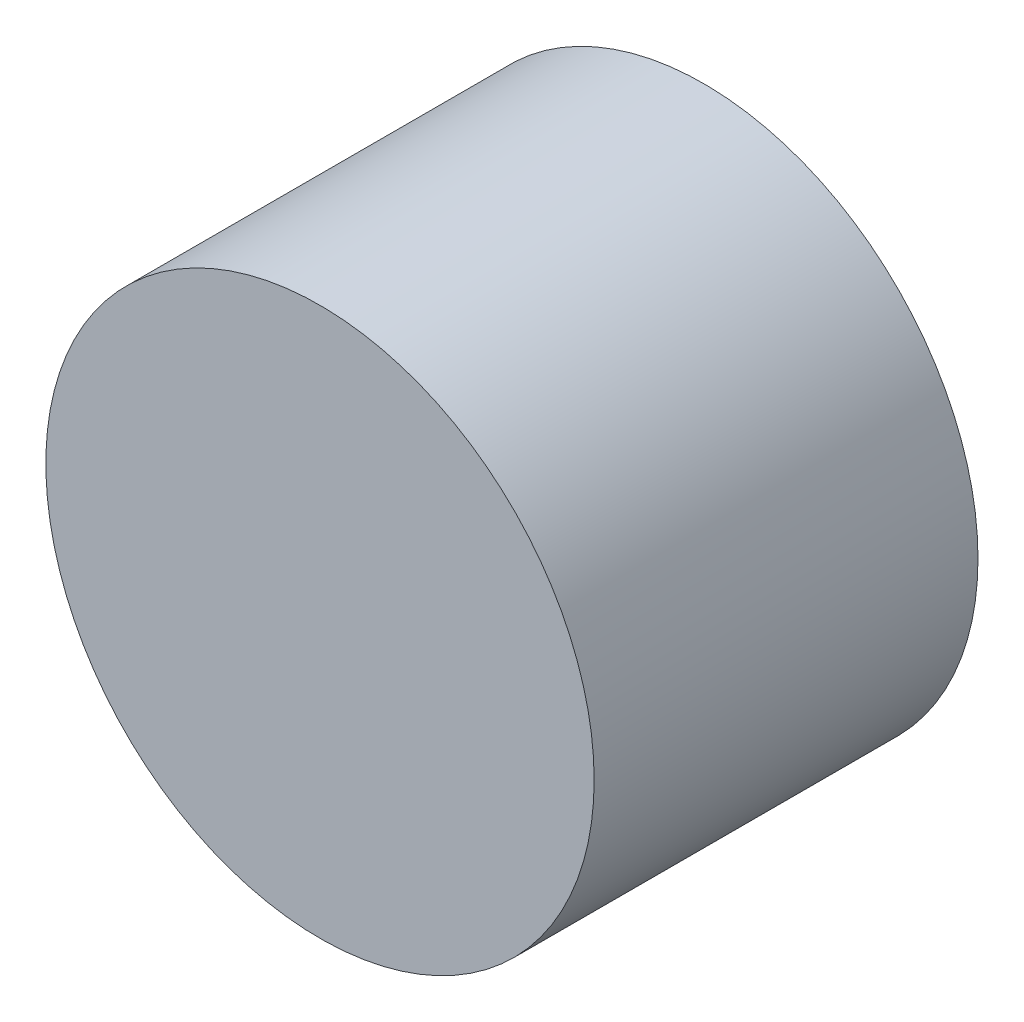
ISO-10303-21;
HEADER;
FILE_DESCRIPTION(('STEP AP214'),'2;1');
FILE_NAME('part.step','',(''),(''),'','','');
FILE_SCHEMA(('AUTOMOTIVE_DESIGN { 1 0 10303 214 1 1 1 1 }'));
ENDSEC;
DATA;
#1=APPLICATION_CONTEXT('core data for automotive mechanical design processes');
#2=APPLICATION_PROTOCOL_DEFINITION('international standard','automotive_design',2000,#1);
#3=PRODUCT_CONTEXT('',#1,'mechanical');
#4=PRODUCT('Part','Part','',(#3));
#5=PRODUCT_RELATED_PRODUCT_CATEGORY('part','',(#4));
#6=PRODUCT_DEFINITION_FORMATION('','',#4);
#7=PRODUCT_DEFINITION_CONTEXT('part definition',#1,'design');
#8=PRODUCT_DEFINITION('design','',#6,#7);
#9=PRODUCT_DEFINITION_SHAPE('','',#8);
#10=(LENGTH_UNIT() NAMED_UNIT(*) SI_UNIT(.MILLI.,.METRE.));
#11=(NAMED_UNIT(*) PLANE_ANGLE_UNIT() SI_UNIT($,.RADIAN.));
#12=(NAMED_UNIT(*) SI_UNIT($,.STERADIAN.) SOLID_ANGLE_UNIT());
#13=UNCERTAINTY_MEASURE_WITH_UNIT(LENGTH_MEASURE(1.E-05),#10,'distance_accuracy_value','');
#14=(GEOMETRIC_REPRESENTATION_CONTEXT(3) GLOBAL_UNCERTAINTY_ASSIGNED_CONTEXT((#13)) GLOBAL_UNIT_ASSIGNED_CONTEXT((#10,
#11,#12)) REPRESENTATION_CONTEXT('',''));
#15=CARTESIAN_POINT('',(0.,0.,0.));
#16=DIRECTION('',(0.,0.,1.));
#17=DIRECTION('',(1.,0.,0.));
#18=AXIS2_PLACEMENT_3D('',#15,#16,#17);
#19=CARTESIAN_POINT('',(-4.97633536173073,-25.8000000000002,21.));
#20=DIRECTION('',(0.,0.,-1.));
#21=DIRECTION('',(-1.,0.,0.));
#22=AXIS2_PLACEMENT_3D('',#19,#20,#21);
#23=CYLINDRICAL_SURFACE('',#22,15.);
#24=CARTESIAN_POINT('',(-4.97633536173073,-25.8000000000002,21.));
#25=DIRECTION('',(0.,0.,1.));
#26=DIRECTION('',(1.,0.,0.));
#27=AXIS2_PLACEMENT_3D('',#24,#25,#26);
#28=CIRCLE('',#27,15.);
#29=CARTESIAN_POINT('',(10.0236646382693,-25.8000000000002,21.));
#30=VERTEX_POINT('',#29);
#31=EDGE_CURVE('E10',#30,#30,#28,.T.);
#32=ORIENTED_EDGE('',*,*,#31,.F.);
#33=EDGE_LOOP('',(#32));
#34=FACE_BOUND('',#33,.T.);
#35=CARTESIAN_POINT('',(-4.97633536173073,-25.8000000000002,0.));
#36=DIRECTION('',(0.,0.,1.));
#37=DIRECTION('',(1.,0.,0.));
#38=AXIS2_PLACEMENT_3D('',#35,#36,#37);
#39=CIRCLE('',#38,15.);
#40=CARTESIAN_POINT('',(10.0236646382693,-25.8000000000002,0.));
#41=VERTEX_POINT('',#40);
#42=EDGE_CURVE('E33',#41,#41,#39,.T.);
#43=ORIENTED_EDGE('',*,*,#42,.T.);
#44=EDGE_LOOP('',(#43));
#45=FACE_BOUND('',#44,.T.);
#46=ADVANCED_FACE('F30',(#34,#45),#23,.T.);
#47=CARTESIAN_POINT('',(-4.97633536173073,-25.8000000000002,21.));
#48=DIRECTION('',(0.,0.,1.));
#49=DIRECTION('',(1.,0.,0.));
#50=AXIS2_PLACEMENT_3D('',#47,#48,#49);
#51=PLANE('',#50);
#52=ORIENTED_EDGE('',*,*,#31,.T.);
#53=EDGE_LOOP('',(#52));
#54=FACE_BOUND('',#53,.T.);
#55=ADVANCED_FACE('F45',(#54),#51,.T.);
#56=CARTESIAN_POINT('',(-4.97633536173073,-25.8000000000002,0.));
#57=DIRECTION('',(0.,0.,1.));
#58=DIRECTION('',(1.,0.,0.));
#59=AXIS2_PLACEMENT_3D('',#56,#57,#58);
#60=PLANE('',#59);
#61=ORIENTED_EDGE('',*,*,#42,.F.);
#62=EDGE_LOOP('',(#61));
#63=FACE_BOUND('',#62,.T.);
#64=ADVANCED_FACE('F43',(#63),#60,.F.);
#65=CLOSED_SHELL('',(#46,#55,#64));
#66=MANIFOLD_SOLID_BREP('B2',#65);
#67=ADVANCED_BREP_SHAPE_REPRESENTATION('',(#18,#66),#14);
#68=SHAPE_DEFINITION_REPRESENTATION(#9,#67);
ENDSEC;
END-ISO-10303-21;
